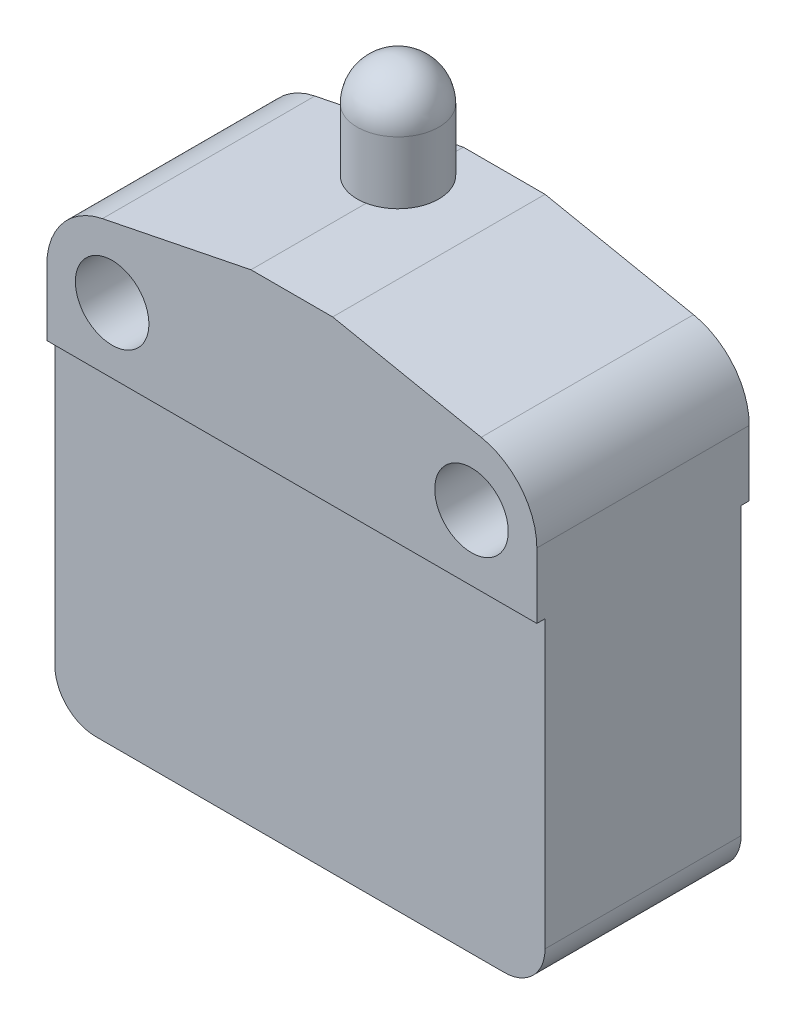
ISO-10303-21;
HEADER;
FILE_DESCRIPTION(('STEP AP214'),'2;1');
FILE_NAME('part.step','',(''),(''),'','','');
FILE_SCHEMA(('AUTOMOTIVE_DESIGN { 1 0 10303 214 1 1 1 1 }'));
ENDSEC;
DATA;
#1=APPLICATION_CONTEXT('core data for automotive mechanical design processes');
#2=APPLICATION_PROTOCOL_DEFINITION('international standard','automotive_design',2000,#1);
#3=PRODUCT_CONTEXT('',#1,'mechanical');
#4=PRODUCT('Part','Part','',(#3));
#5=PRODUCT_RELATED_PRODUCT_CATEGORY('part','',(#4));
#6=PRODUCT_DEFINITION_FORMATION('','',#4);
#7=PRODUCT_DEFINITION_CONTEXT('part definition',#1,'design');
#8=PRODUCT_DEFINITION('design','',#6,#7);
#9=PRODUCT_DEFINITION_SHAPE('','',#8);
#10=(LENGTH_UNIT() NAMED_UNIT(*) SI_UNIT(.MILLI.,.METRE.));
#11=(NAMED_UNIT(*) PLANE_ANGLE_UNIT() SI_UNIT($,.RADIAN.));
#12=(NAMED_UNIT(*) SI_UNIT($,.STERADIAN.) SOLID_ANGLE_UNIT());
#13=UNCERTAINTY_MEASURE_WITH_UNIT(LENGTH_MEASURE(1.E-05),#10,'distance_accuracy_value','');
#14=(GEOMETRIC_REPRESENTATION_CONTEXT(3) GLOBAL_UNCERTAINTY_ASSIGNED_CONTEXT((#13)) GLOBAL_UNIT_ASSIGNED_CONTEXT((#10,
#11,#12)) REPRESENTATION_CONTEXT('',''));
#15=CARTESIAN_POINT('',(0.,0.,0.));
#16=DIRECTION('',(0.,0.,1.));
#17=DIRECTION('',(1.,0.,0.));
#18=AXIS2_PLACEMENT_3D('',#15,#16,#17);
#19=CARTESIAN_POINT('',(12.5,-12.5,6.5));
#20=DIRECTION('',(0.,0.,1.));
#21=DIRECTION('',(1.,0.,0.));
#22=AXIS2_PLACEMENT_3D('',#19,#20,#21);
#23=PLANE('',#22);
#24=CARTESIAN_POINT('',(-11.,9.,6.5));
#25=DIRECTION('',(0.,0.,1.));
#26=DIRECTION('',(1.,0.,0.));
#27=AXIS2_PLACEMENT_3D('',#24,#25,#26);
#28=CIRCLE('',#27,2.25);
#29=CARTESIAN_POINT('',(-13.25,9.,6.5));
#30=VERTEX_POINT('',#29);
#31=EDGE_CURVE('E213',#30,#30,#28,.T.);
#32=ORIENTED_EDGE('',*,*,#31,.F.);
#33=EDGE_LOOP('',(#32));
#34=FACE_BOUND('',#33,.T.);
#35=CARTESIAN_POINT('',(11.,8.99999999999999,6.5));
#36=DIRECTION('',(0.,0.,1.));
#37=DIRECTION('',(-1.,0.,0.));
#38=AXIS2_PLACEMENT_3D('',#35,#36,#37);
#39=CIRCLE('',#38,2.25);
#40=CARTESIAN_POINT('',(8.75,8.99999999999999,6.5));
#41=VERTEX_POINT('',#40);
#42=EDGE_CURVE('E141',#41,#41,#39,.T.);
#43=ORIENTED_EDGE('',*,*,#42,.F.);
#44=EDGE_LOOP('',(#43));
#45=FACE_BOUND('',#44,.T.);
#46=DIRECTION('',(0.,-1.,0.));
#47=VECTOR('',#46,1.);
#48=CARTESIAN_POINT('',(-15.,9.,6.5));
#49=LINE('',#48,#47);
#50=CARTESIAN_POINT('',(-15.,9.,6.5));
#51=VERTEX_POINT('',#50);
#52=CARTESIAN_POINT('',(-15.,5.,6.5));
#53=VERTEX_POINT('',#52);
#54=EDGE_CURVE('E190',#51,#53,#49,.T.);
#55=ORIENTED_EDGE('',*,*,#54,.T.);
#56=DIRECTION('',(1.,0.,0.));
#57=VECTOR('',#56,1.);
#58=CARTESIAN_POINT('',(12.5,5.,6.5));
#59=LINE('',#58,#57);
#60=CARTESIAN_POINT('',(15.,5.,6.5));
#61=VERTEX_POINT('',#60);
#62=EDGE_CURVE('E128',#53,#61,#59,.T.);
#63=ORIENTED_EDGE('',*,*,#62,.T.);
#64=DIRECTION('',(0.,1.,0.));
#65=VECTOR('',#64,1.);
#66=CARTESIAN_POINT('',(15.,8.99999999999999,6.5));
#67=LINE('',#66,#65);
#68=CARTESIAN_POINT('',(15.,8.99999999999999,6.5));
#69=VERTEX_POINT('',#68);
#70=EDGE_CURVE('E208',#61,#69,#67,.T.);
#71=ORIENTED_EDGE('',*,*,#70,.T.);
#72=CARTESIAN_POINT('',(10.75,8.99999999999999,6.5));
#73=DIRECTION('',(0.,0.,1.));
#74=DIRECTION('',(-1.,0.,0.));
#75=AXIS2_PLACEMENT_3D('',#72,#73,#74);
#76=CIRCLE('',#75,4.25);
#77=CARTESIAN_POINT('',(11.5904722799773,13.1660660516355,6.5));
#78=VERTEX_POINT('',#77);
#79=EDGE_CURVE('E205',#69,#78,#76,.T.);
#80=ORIENTED_EDGE('',*,*,#79,.T.);
#81=DIRECTION('',(-0.980250835678939,0.197758183524076,0.));
#82=VECTOR('',#81,1.);
#83=CARTESIAN_POINT('',(2.5,15.,6.5));
#84=LINE('',#83,#82);
#85=CARTESIAN_POINT('',(2.5,15.,6.5));
#86=VERTEX_POINT('',#85);
#87=EDGE_CURVE('E202',#78,#86,#84,.T.);
#88=ORIENTED_EDGE('',*,*,#87,.T.);
#89=DIRECTION('',(-1.,0.,0.));
#90=VECTOR('',#89,1.);
#91=CARTESIAN_POINT('',(-2.5,15.,6.5));
#92=LINE('',#91,#90);
#93=CARTESIAN_POINT('',(-2.5,15.,6.5));
#94=VERTEX_POINT('',#93);
#95=EDGE_CURVE('E199',#86,#94,#92,.T.);
#96=ORIENTED_EDGE('',*,*,#95,.T.);
#97=DIRECTION('',(-0.980250835678939,-0.197758183524076,0.));
#98=VECTOR('',#97,1.);
#99=CARTESIAN_POINT('',(-2.5,15.,6.5));
#100=LINE('',#99,#98);
#101=CARTESIAN_POINT('',(-11.5904722799773,13.1660660516355,6.5));
#102=VERTEX_POINT('',#101);
#103=EDGE_CURVE('E196',#94,#102,#100,.T.);
#104=ORIENTED_EDGE('',*,*,#103,.T.);
#105=CARTESIAN_POINT('',(-10.75,9.,6.5));
#106=DIRECTION('',(0.,0.,1.));
#107=DIRECTION('',(1.,0.,0.));
#108=AXIS2_PLACEMENT_3D('',#105,#106,#107);
#109=CIRCLE('',#108,4.25);
#110=EDGE_CURVE('E192',#102,#51,#109,.T.);
#111=ORIENTED_EDGE('',*,*,#110,.T.);
#112=EDGE_LOOP('',(#55,#63,#71,#80,#88,#96,#104,#111));
#113=FACE_BOUND('',#112,.T.);
#114=ADVANCED_FACE('F41',(#34,#45,#113),#23,.T.);
#115=CARTESIAN_POINT('',(12.5,-12.5,-6.5));
#116=DIRECTION('',(0.,0.,1.));
#117=DIRECTION('',(1.,0.,0.));
#118=AXIS2_PLACEMENT_3D('',#115,#116,#117);
#119=PLANE('',#118);
#120=CARTESIAN_POINT('',(11.,8.99999999999999,-6.5));
#121=DIRECTION('',(0.,0.,1.));
#122=DIRECTION('',(-1.,0.,0.));
#123=AXIS2_PLACEMENT_3D('',#120,#121,#122);
#124=CIRCLE('',#123,2.25);
#125=CARTESIAN_POINT('',(8.75,8.99999999999999,-6.5));
#126=VERTEX_POINT('',#125);
#127=EDGE_CURVE('E195',#126,#126,#124,.T.);
#128=ORIENTED_EDGE('',*,*,#127,.T.);
#129=EDGE_LOOP('',(#128));
#130=FACE_BOUND('',#129,.T.);
#131=CARTESIAN_POINT('',(-11.,9.,-6.5));
#132=DIRECTION('',(0.,0.,1.));
#133=DIRECTION('',(1.,0.,0.));
#134=AXIS2_PLACEMENT_3D('',#131,#132,#133);
#135=CIRCLE('',#134,2.25);
#136=CARTESIAN_POINT('',(-13.25,9.,-6.5));
#137=VERTEX_POINT('',#136);
#138=EDGE_CURVE('E166',#137,#137,#135,.T.);
#139=ORIENTED_EDGE('',*,*,#138,.T.);
#140=EDGE_LOOP('',(#139));
#141=FACE_BOUND('',#140,.T.);
#142=DIRECTION('',(1.,0.,0.));
#143=VECTOR('',#142,1.);
#144=CARTESIAN_POINT('',(12.5,5.,-6.5));
#145=LINE('',#144,#143);
#146=CARTESIAN_POINT('',(-15.,5.,-6.5));
#147=VERTEX_POINT('',#146);
#148=CARTESIAN_POINT('',(15.,5.,-6.5));
#149=VERTEX_POINT('',#148);
#150=EDGE_CURVE('E108',#147,#149,#145,.T.);
#151=ORIENTED_EDGE('',*,*,#150,.F.);
#152=DIRECTION('',(0.,-1.,0.));
#153=VECTOR('',#152,1.);
#154=CARTESIAN_POINT('',(-15.,9.,-6.5));
#155=LINE('',#154,#153);
#156=CARTESIAN_POINT('',(-15.,9.,-6.5));
#157=VERTEX_POINT('',#156);
#158=EDGE_CURVE('E107',#157,#147,#155,.T.);
#159=ORIENTED_EDGE('',*,*,#158,.F.);
#160=CARTESIAN_POINT('',(-10.75,9.,-6.5));
#161=DIRECTION('',(0.,0.,1.));
#162=DIRECTION('',(1.,0.,0.));
#163=AXIS2_PLACEMENT_3D('',#160,#161,#162);
#164=CIRCLE('',#163,4.25);
#165=CARTESIAN_POINT('',(-11.5904722799773,13.1660660516355,-6.5));
#166=VERTEX_POINT('',#165);
#167=EDGE_CURVE('E168',#166,#157,#164,.T.);
#168=ORIENTED_EDGE('',*,*,#167,.F.);
#169=DIRECTION('',(-0.980250835678939,-0.197758183524076,0.));
#170=VECTOR('',#169,1.);
#171=CARTESIAN_POINT('',(-2.5,15.,-6.5));
#172=LINE('',#171,#170);
#173=CARTESIAN_POINT('',(-2.5,15.,-6.5));
#174=VERTEX_POINT('',#173);
#175=EDGE_CURVE('E173',#174,#166,#172,.T.);
#176=ORIENTED_EDGE('',*,*,#175,.F.);
#177=DIRECTION('',(-1.,0.,0.));
#178=VECTOR('',#177,1.);
#179=CARTESIAN_POINT('',(-2.5,15.,-6.5));
#180=LINE('',#179,#178);
#181=CARTESIAN_POINT('',(2.5,15.,-6.5));
#182=VERTEX_POINT('',#181);
#183=EDGE_CURVE('E176',#182,#174,#180,.T.);
#184=ORIENTED_EDGE('',*,*,#183,.F.);
#185=DIRECTION('',(-0.980250835678939,0.197758183524076,0.));
#186=VECTOR('',#185,1.);
#187=CARTESIAN_POINT('',(2.5,15.,-6.5));
#188=LINE('',#187,#186);
#189=CARTESIAN_POINT('',(11.5904722799773,13.1660660516355,-6.5));
#190=VERTEX_POINT('',#189);
#191=EDGE_CURVE('E180',#190,#182,#188,.T.);
#192=ORIENTED_EDGE('',*,*,#191,.F.);
#193=CARTESIAN_POINT('',(10.75,8.99999999999999,-6.5));
#194=DIRECTION('',(0.,0.,1.));
#195=DIRECTION('',(-1.,0.,0.));
#196=AXIS2_PLACEMENT_3D('',#193,#194,#195);
#197=CIRCLE('',#196,4.25);
#198=CARTESIAN_POINT('',(15.,8.99999999999999,-6.5));
#199=VERTEX_POINT('',#198);
#200=EDGE_CURVE('E184',#199,#190,#197,.T.);
#201=ORIENTED_EDGE('',*,*,#200,.F.);
#202=DIRECTION('',(0.,1.,0.));
#203=VECTOR('',#202,1.);
#204=CARTESIAN_POINT('',(15.,8.99999999999999,-6.5));
#205=LINE('',#204,#203);
#206=EDGE_CURVE('E187',#149,#199,#205,.T.);
#207=ORIENTED_EDGE('',*,*,#206,.F.);
#208=EDGE_LOOP('',(#151,#159,#168,#176,#184,#192,#201,#207));
#209=FACE_BOUND('',#208,.T.);
#210=ADVANCED_FACE('F225',(#130,#141,#209),#119,.F.);
#211=CARTESIAN_POINT('',(12.5,-12.5,6.5));
#212=DIRECTION('',(0.,0.,-1.));
#213=DIRECTION('',(-1.,0.,0.));
#214=AXIS2_PLACEMENT_3D('',#211,#212,#213);
#215=CYLINDRICAL_SURFACE('',#214,2.5);
#216=CARTESIAN_POINT('',(12.5,-12.5,6.));
#217=DIRECTION('',(0.,0.,1.));
#218=DIRECTION('',(1.,0.,0.));
#219=AXIS2_PLACEMENT_3D('',#216,#217,#218);
#220=CIRCLE('',#219,2.5);
#221=CARTESIAN_POINT('',(12.5,-15.,6.));
#222=VERTEX_POINT('',#221);
#223=CARTESIAN_POINT('',(15.,-12.5,6.));
#224=VERTEX_POINT('',#223);
#225=EDGE_CURVE('E115',#222,#224,#220,.T.);
#226=ORIENTED_EDGE('',*,*,#225,.F.);
#227=DIRECTION('',(0.,0.,-1.));
#228=VECTOR('',#227,1.);
#229=CARTESIAN_POINT('',(12.5,-15.,6.5));
#230=LINE('',#229,#228);
#231=CARTESIAN_POINT('',(12.5,-15.,-6.));
#232=VERTEX_POINT('',#231);
#233=EDGE_CURVE('E163',#222,#232,#230,.T.);
#234=ORIENTED_EDGE('',*,*,#233,.T.);
#235=CARTESIAN_POINT('',(12.5,-12.5,-6.));
#236=DIRECTION('',(0.,0.,-1.));
#237=DIRECTION('',(-1.,0.,0.));
#238=AXIS2_PLACEMENT_3D('',#235,#236,#237);
#239=CIRCLE('',#238,2.5);
#240=CARTESIAN_POINT('',(15.,-12.5,-6.));
#241=VERTEX_POINT('',#240);
#242=EDGE_CURVE('E138',#241,#232,#239,.T.);
#243=ORIENTED_EDGE('',*,*,#242,.F.);
#244=DIRECTION('',(0.,0.,-1.));
#245=VECTOR('',#244,1.);
#246=CARTESIAN_POINT('',(15.,-12.5,6.5));
#247=LINE('',#246,#245);
#248=EDGE_CURVE('E165',#224,#241,#247,.T.);
#249=ORIENTED_EDGE('',*,*,#248,.F.);
#250=EDGE_LOOP('',(#226,#234,#243,#249));
#251=FACE_BOUND('',#250,.T.);
#252=ADVANCED_FACE('F261',(#251),#215,.T.);
#253=CARTESIAN_POINT('',(15.,8.99999999999999,6.5));
#254=DIRECTION('',(-1.,0.,0.));
#255=DIRECTION('',(0.,-1.,0.));
#256=AXIS2_PLACEMENT_3D('',#253,#254,#255);
#257=PLANE('',#256);
#258=DIRECTION('',(0.,0.,1.));
#259=VECTOR('',#258,1.);
#260=CARTESIAN_POINT('',(15.,5.,6.5));
#261=LINE('',#260,#259);
#262=CARTESIAN_POINT('',(15.,5.,6.));
#263=VERTEX_POINT('',#262);
#264=EDGE_CURVE('E111',#263,#61,#261,.T.);
#265=ORIENTED_EDGE('',*,*,#264,.F.);
#266=DIRECTION('',(0.,1.,0.));
#267=VECTOR('',#266,1.);
#268=CARTESIAN_POINT('',(15.,8.99999999999999,6.));
#269=LINE('',#268,#267);
#270=EDGE_CURVE('E121',#224,#263,#269,.T.);
#271=ORIENTED_EDGE('',*,*,#270,.F.);
#272=ORIENTED_EDGE('',*,*,#248,.T.);
#273=DIRECTION('',(0.,-1.,0.));
#274=VECTOR('',#273,1.);
#275=CARTESIAN_POINT('',(15.,8.99999999999999,-6.));
#276=LINE('',#275,#274);
#277=CARTESIAN_POINT('',(15.,5.,-6.));
#278=VERTEX_POINT('',#277);
#279=EDGE_CURVE('E101',#278,#241,#276,.T.);
#280=ORIENTED_EDGE('',*,*,#279,.F.);
#281=EDGE_CURVE('E100',#149,#278,#261,.T.);
#282=ORIENTED_EDGE('',*,*,#281,.F.);
#283=ORIENTED_EDGE('',*,*,#206,.T.);
#284=DIRECTION('',(0.,0.,-1.));
#285=VECTOR('',#284,1.);
#286=CARTESIAN_POINT('',(15.,8.99999999999999,6.5));
#287=LINE('',#286,#285);
#288=EDGE_CURVE('E183',#69,#199,#287,.T.);
#289=ORIENTED_EDGE('',*,*,#288,.F.);
#290=ORIENTED_EDGE('',*,*,#70,.F.);
#291=EDGE_LOOP('',(#265,#271,#272,#280,#282,#283,#289,#290));
#292=FACE_BOUND('',#291,.T.);
#293=ADVANCED_FACE('F259',(#292),#257,.F.);
#294=CARTESIAN_POINT('',(-15.,9.,6.5));
#295=DIRECTION('',(1.,0.,0.));
#296=DIRECTION('',(0.,1.,0.));
#297=AXIS2_PLACEMENT_3D('',#294,#295,#296);
#298=PLANE('',#297);
#299=DIRECTION('',(0.,0.,-1.));
#300=VECTOR('',#299,1.);
#301=CARTESIAN_POINT('',(-15.,5.,6.5));
#302=LINE('',#301,#300);
#303=CARTESIAN_POINT('',(-15.,5.,6.));
#304=VERTEX_POINT('',#303);
#305=EDGE_CURVE('E110',#53,#304,#302,.T.);
#306=ORIENTED_EDGE('',*,*,#305,.F.);
#307=ORIENTED_EDGE('',*,*,#54,.F.);
#308=DIRECTION('',(0.,0.,-1.));
#309=VECTOR('',#308,1.);
#310=CARTESIAN_POINT('',(-15.,9.,6.5));
#311=LINE('',#310,#309);
#312=EDGE_CURVE('E158',#51,#157,#311,.T.);
#313=ORIENTED_EDGE('',*,*,#312,.T.);
#314=ORIENTED_EDGE('',*,*,#158,.T.);
#315=CARTESIAN_POINT('',(-15.,5.,-6.));
#316=VERTEX_POINT('',#315);
#317=EDGE_CURVE('E97',#316,#147,#302,.T.);
#318=ORIENTED_EDGE('',*,*,#317,.F.);
#319=DIRECTION('',(0.,1.,0.));
#320=VECTOR('',#319,1.);
#321=CARTESIAN_POINT('',(-15.,9.,-6.));
#322=LINE('',#321,#320);
#323=CARTESIAN_POINT('',(-15.,-12.5,-6.));
#324=VERTEX_POINT('',#323);
#325=EDGE_CURVE('E80',#324,#316,#322,.T.);
#326=ORIENTED_EDGE('',*,*,#325,.F.);
#327=DIRECTION('',(0.,0.,-1.));
#328=VECTOR('',#327,1.);
#329=CARTESIAN_POINT('',(-15.,-12.5,6.5));
#330=LINE('',#329,#328);
#331=CARTESIAN_POINT('',(-15.,-12.5,6.));
#332=VERTEX_POINT('',#331);
#333=EDGE_CURVE('E150',#332,#324,#330,.T.);
#334=ORIENTED_EDGE('',*,*,#333,.F.);
#335=DIRECTION('',(0.,-1.,0.));
#336=VECTOR('',#335,1.);
#337=CARTESIAN_POINT('',(-15.,9.,6.));
#338=LINE('',#337,#336);
#339=EDGE_CURVE('E134',#304,#332,#338,.T.);
#340=ORIENTED_EDGE('',*,*,#339,.F.);
#341=EDGE_LOOP('',(#306,#307,#313,#314,#318,#326,#334,#340));
#342=FACE_BOUND('',#341,.T.);
#343=ADVANCED_FACE('F104',(#342),#298,.F.);
#344=CARTESIAN_POINT('',(-12.5,-12.5,6.5));
#345=DIRECTION('',(0.,0.,-1.));
#346=DIRECTION('',(-1.,0.,0.));
#347=AXIS2_PLACEMENT_3D('',#344,#345,#346);
#348=CYLINDRICAL_SURFACE('',#347,2.5);
#349=CARTESIAN_POINT('',(-12.5,-12.5,6.));
#350=DIRECTION('',(0.,0.,1.));
#351=DIRECTION('',(1.,0.,0.));
#352=AXIS2_PLACEMENT_3D('',#349,#350,#351);
#353=CIRCLE('',#352,2.5);
#354=CARTESIAN_POINT('',(-12.5,-15.,6.));
#355=VERTEX_POINT('',#354);
#356=EDGE_CURVE('E51',#332,#355,#353,.T.);
#357=ORIENTED_EDGE('',*,*,#356,.F.);
#358=ORIENTED_EDGE('',*,*,#333,.T.);
#359=CARTESIAN_POINT('',(-12.5,-12.5,-6.));
#360=DIRECTION('',(0.,0.,-1.));
#361=DIRECTION('',(-1.,0.,0.));
#362=AXIS2_PLACEMENT_3D('',#359,#360,#361);
#363=CIRCLE('',#362,2.5);
#364=CARTESIAN_POINT('',(-12.5,-15.,-6.));
#365=VERTEX_POINT('',#364);
#366=EDGE_CURVE('E87',#365,#324,#363,.T.);
#367=ORIENTED_EDGE('',*,*,#366,.F.);
#368=DIRECTION('',(0.,0.,-1.));
#369=VECTOR('',#368,1.);
#370=CARTESIAN_POINT('',(-12.5,-15.,6.5));
#371=LINE('',#370,#369);
#372=EDGE_CURVE('E153',#355,#365,#371,.T.);
#373=ORIENTED_EDGE('',*,*,#372,.F.);
#374=EDGE_LOOP('',(#357,#358,#367,#373));
#375=FACE_BOUND('',#374,.T.);
#376=ADVANCED_FACE('F311',(#375),#348,.T.);
#377=CARTESIAN_POINT('',(-12.5,-15.,6.5));
#378=DIRECTION('',(0.,1.,0.));
#379=DIRECTION('',(0.,0.,1.));
#380=AXIS2_PLACEMENT_3D('',#377,#378,#379);
#381=PLANE('',#380);
#382=DIRECTION('',(1.,0.,0.));
#383=VECTOR('',#382,1.);
#384=CARTESIAN_POINT('',(-12.5,-15.,6.));
#385=LINE('',#384,#383);
#386=EDGE_CURVE('E13',#355,#222,#385,.T.);
#387=ORIENTED_EDGE('',*,*,#386,.F.);
#388=ORIENTED_EDGE('',*,*,#372,.T.);
#389=DIRECTION('',(-1.,0.,0.));
#390=VECTOR('',#389,1.);
#391=CARTESIAN_POINT('',(-12.5,-15.,-6.));
#392=LINE('',#391,#390);
#393=EDGE_CURVE('E140',#232,#365,#392,.T.);
#394=ORIENTED_EDGE('',*,*,#393,.F.);
#395=ORIENTED_EDGE('',*,*,#233,.F.);
#396=EDGE_LOOP('',(#387,#388,#394,#395));
#397=FACE_BOUND('',#396,.T.);
#398=ADVANCED_FACE('F309',(#397),#381,.F.);
#399=CARTESIAN_POINT('',(-2.5,15.,6.5));
#400=DIRECTION('',(0.,-1.,0.));
#401=DIRECTION('',(1.,0.,0.));
#402=AXIS2_PLACEMENT_3D('',#399,#400,#401);
#403=PLANE('',#402);
#404=DIRECTION('',(0.,0.,-1.));
#405=VECTOR('',#404,1.);
#406=CARTESIAN_POINT('',(2.5,15.,6.5));
#407=LINE('',#406,#405);
#408=EDGE_CURVE('E156',#86,#182,#407,.T.);
#409=ORIENTED_EDGE('',*,*,#408,.T.);
#410=ORIENTED_EDGE('',*,*,#183,.T.);
#411=DIRECTION('',(0.,0.,-1.));
#412=VECTOR('',#411,1.);
#413=CARTESIAN_POINT('',(-2.5,15.,6.5));
#414=LINE('',#413,#412);
#415=EDGE_CURVE('E172',#94,#174,#414,.T.);
#416=ORIENTED_EDGE('',*,*,#415,.F.);
#417=ORIENTED_EDGE('',*,*,#95,.F.);
#418=EDGE_LOOP('',(#409,#410,#416,#417));
#419=FACE_BOUND('',#418,.T.);
#420=ADVANCED_FACE('F305',(#419),#403,.F.);
#421=CARTESIAN_POINT('',(10.75,8.99999999999999,6.5));
#422=DIRECTION('',(0.,0.,-1.));
#423=DIRECTION('',(-1.,0.,0.));
#424=AXIS2_PLACEMENT_3D('',#421,#422,#423);
#425=CYLINDRICAL_SURFACE('',#424,4.25);
#426=ORIENTED_EDGE('',*,*,#200,.T.);
#427=DIRECTION('',(0.,0.,-1.));
#428=VECTOR('',#427,1.);
#429=CARTESIAN_POINT('',(11.5904722799773,13.1660660516355,6.5));
#430=LINE('',#429,#428);
#431=EDGE_CURVE('E179',#78,#190,#430,.T.);
#432=ORIENTED_EDGE('',*,*,#431,.F.);
#433=ORIENTED_EDGE('',*,*,#79,.F.);
#434=ORIENTED_EDGE('',*,*,#288,.T.);
#435=EDGE_LOOP('',(#426,#432,#433,#434));
#436=FACE_BOUND('',#435,.T.);
#437=ADVANCED_FACE('F295',(#436),#425,.T.);
#438=CARTESIAN_POINT('',(2.5,15.,6.5));
#439=DIRECTION('',(-0.197758183524076,-0.980250835678939,0.));
#440=DIRECTION('',(0.980250835678939,-0.197758183524076,0.));
#441=AXIS2_PLACEMENT_3D('',#438,#439,#440);
#442=PLANE('',#441);
#443=ORIENTED_EDGE('',*,*,#191,.T.);
#444=ORIENTED_EDGE('',*,*,#408,.F.);
#445=ORIENTED_EDGE('',*,*,#87,.F.);
#446=ORIENTED_EDGE('',*,*,#431,.T.);
#447=EDGE_LOOP('',(#443,#444,#445,#446));
#448=FACE_BOUND('',#447,.T.);
#449=ADVANCED_FACE('F301',(#448),#442,.F.);
#450=CARTESIAN_POINT('',(-2.5,15.,6.5));
#451=DIRECTION('',(0.197758183524076,-0.980250835678939,0.));
#452=DIRECTION('',(0.980250835678939,0.197758183524076,0.));
#453=AXIS2_PLACEMENT_3D('',#450,#451,#452);
#454=PLANE('',#453);
#455=ORIENTED_EDGE('',*,*,#175,.T.);
#456=DIRECTION('',(0.,0.,-1.));
#457=VECTOR('',#456,1.);
#458=CARTESIAN_POINT('',(-11.5904722799773,13.1660660516355,6.5));
#459=LINE('',#458,#457);
#460=EDGE_CURVE('E171',#102,#166,#459,.T.);
#461=ORIENTED_EDGE('',*,*,#460,.F.);
#462=ORIENTED_EDGE('',*,*,#103,.F.);
#463=ORIENTED_EDGE('',*,*,#415,.T.);
#464=EDGE_LOOP('',(#455,#461,#462,#463));
#465=FACE_BOUND('',#464,.T.);
#466=ADVANCED_FACE('F373',(#465),#454,.F.);
#467=CARTESIAN_POINT('',(-10.75,9.,6.5));
#468=DIRECTION('',(0.,0.,-1.));
#469=DIRECTION('',(-1.,0.,0.));
#470=AXIS2_PLACEMENT_3D('',#467,#468,#469);
#471=CYLINDRICAL_SURFACE('',#470,4.25);
#472=ORIENTED_EDGE('',*,*,#167,.T.);
#473=ORIENTED_EDGE('',*,*,#312,.F.);
#474=ORIENTED_EDGE('',*,*,#110,.F.);
#475=ORIENTED_EDGE('',*,*,#460,.T.);
#476=EDGE_LOOP('',(#472,#473,#474,#475));
#477=FACE_BOUND('',#476,.T.);
#478=ADVANCED_FACE('F277',(#477),#471,.T.);
#479=CARTESIAN_POINT('',(-11.,9.,6.5));
#480=DIRECTION('',(0.,0.,-1.));
#481=DIRECTION('',(-1.,0.,0.));
#482=AXIS2_PLACEMENT_3D('',#479,#480,#481);
#483=CYLINDRICAL_SURFACE('',#482,2.25);
#484=CARTESIAN_POINT('',(-13.25,9.,6.5));
#485=CARTESIAN_POINT('',(-13.25,9.,6.36458333333333));
#486=CARTESIAN_POINT('',(-13.25,9.,6.22916666666667));
#487=CARTESIAN_POINT('',(-13.25,9.,5.95833333333333));
#488=CARTESIAN_POINT('',(-13.25,9.,5.82291666666667));
#489=CARTESIAN_POINT('',(-13.25,9.,5.55208333333333));
#490=CARTESIAN_POINT('',(-13.25,9.,5.41666666666667));
#491=CARTESIAN_POINT('',(-13.25,9.,5.14583333333333));
#492=CARTESIAN_POINT('',(-13.25,9.,5.01041666666667));
#493=CARTESIAN_POINT('',(-13.25,9.,4.73958333333333));
#494=CARTESIAN_POINT('',(-13.25,9.,4.60416666666667));
#495=CARTESIAN_POINT('',(-13.25,9.,4.33333333333333));
#496=CARTESIAN_POINT('',(-13.25,9.,4.19791666666667));
#497=CARTESIAN_POINT('',(-13.25,9.,3.92708333333333));
#498=CARTESIAN_POINT('',(-13.25,9.,3.79166666666667));
#499=CARTESIAN_POINT('',(-13.25,9.,3.52083333333333));
#500=CARTESIAN_POINT('',(-13.25,9.,3.38541666666667));
#501=CARTESIAN_POINT('',(-13.25,9.,3.11458333333333));
#502=CARTESIAN_POINT('',(-13.25,9.,2.97916666666667));
#503=CARTESIAN_POINT('',(-13.25,9.,2.70833333333333));
#504=CARTESIAN_POINT('',(-13.25,9.,2.57291666666667));
#505=CARTESIAN_POINT('',(-13.25,9.,2.30208333333333));
#506=CARTESIAN_POINT('',(-13.25,9.,2.16666666666667));
#507=CARTESIAN_POINT('',(-13.25,9.,1.89583333333333));
#508=CARTESIAN_POINT('',(-13.25,9.,1.76041666666667));
#509=CARTESIAN_POINT('',(-13.25,9.,1.48958333333333));
#510=CARTESIAN_POINT('',(-13.25,9.,1.35416666666667));
#511=CARTESIAN_POINT('',(-13.25,9.,1.08333333333333));
#512=CARTESIAN_POINT('',(-13.25,9.,0.947916666666666));
#513=CARTESIAN_POINT('',(-13.25,9.,0.677083333333332));
#514=CARTESIAN_POINT('',(-13.25,9.,0.541666666666666));
#515=CARTESIAN_POINT('',(-13.25,9.,0.270833333333333));
#516=CARTESIAN_POINT('',(-13.25,9.,0.135416666666666));
#517=CARTESIAN_POINT('',(-13.25,9.,-0.135416666666668));
#518=CARTESIAN_POINT('',(-13.25,9.,-0.270833333333334));
#519=CARTESIAN_POINT('',(-13.25,9.,-0.541666666666668));
#520=CARTESIAN_POINT('',(-13.25,9.,-0.677083333333334));
#521=CARTESIAN_POINT('',(-13.25,9.,-0.947916666666667));
#522=CARTESIAN_POINT('',(-13.25,9.,-1.08333333333333));
#523=CARTESIAN_POINT('',(-13.25,9.,-1.35416666666667));
#524=CARTESIAN_POINT('',(-13.25,9.,-1.48958333333333));
#525=CARTESIAN_POINT('',(-13.25,9.,-1.76041666666667));
#526=CARTESIAN_POINT('',(-13.25,9.,-1.89583333333333));
#527=CARTESIAN_POINT('',(-13.25,9.,-2.16666666666667));
#528=CARTESIAN_POINT('',(-13.25,9.,-2.30208333333333));
#529=CARTESIAN_POINT('',(-13.25,9.,-2.57291666666667));
#530=CARTESIAN_POINT('',(-13.25,9.,-2.70833333333333));
#531=CARTESIAN_POINT('',(-13.25,9.,-2.97916666666667));
#532=CARTESIAN_POINT('',(-13.25,9.,-3.11458333333333));
#533=CARTESIAN_POINT('',(-13.25,9.,-3.38541666666667));
#534=CARTESIAN_POINT('',(-13.25,9.,-3.52083333333333));
#535=CARTESIAN_POINT('',(-13.25,9.,-3.79166666666667));
#536=CARTESIAN_POINT('',(-13.25,9.,-3.92708333333333));
#537=CARTESIAN_POINT('',(-13.25,9.,-4.19791666666667));
#538=CARTESIAN_POINT('',(-13.25,9.,-4.33333333333333));
#539=CARTESIAN_POINT('',(-13.25,9.,-4.60416666666667));
#540=CARTESIAN_POINT('',(-13.25,9.,-4.73958333333333));
#541=CARTESIAN_POINT('',(-13.25,9.,-5.01041666666667));
#542=CARTESIAN_POINT('',(-13.25,9.,-5.14583333333333));
#543=CARTESIAN_POINT('',(-13.25,9.,-5.41666666666667));
#544=CARTESIAN_POINT('',(-13.25,9.,-5.55208333333333));
#545=CARTESIAN_POINT('',(-13.25,9.,-5.82291666666667));
#546=CARTESIAN_POINT('',(-13.25,9.,-5.95833333333333));
#547=CARTESIAN_POINT('',(-13.25,9.,-6.22916666666667));
#548=CARTESIAN_POINT('',(-13.25,9.,-6.36458333333333));
#549=CARTESIAN_POINT('',(-13.25,9.,-6.5));
#550=B_SPLINE_CURVE_WITH_KNOTS('',3,(#484,#485,#486,#487,#488,#489,#490,#491,#492,#493,#494,
#495,#496,#497,#498,#499,#500,#501,#502,#503,#504,#505,#506,#507,#508,#509,#510,#511,#512,#513,
#514,#515,#516,#517,#518,#519,#520,#521,#522,#523,#524,#525,#526,#527,#528,#529,#530,#531,#532,
#533,#534,#535,#536,#537,#538,#539,#540,#541,#542,#543,#544,#545,#546,#547,#548,#549),
.UNSPECIFIED.,.F.,.F.,(4,2,2,2,2,2,2,2,2,2,2,2,2,2,2,2,2,2,2,2,2,2,2,2,2,2,2,2,2,2,2,2,4),(0.,
0.40625,0.8125,1.21875,1.625,2.03125,2.4375,2.84375,3.25,3.65625,4.0625,4.46875,4.875,5.28125,
5.6875,6.09375,6.5,6.90625,7.3125,7.71875,8.125,8.53125,8.9375,9.34375,9.75,10.15625,10.5625,
10.96875,11.375,11.78125,12.1875,12.59375,13.),.UNSPECIFIED.);
#551=EDGE_CURVE('BSEAM325',#30,#137,#550,.T.);
#552=ORIENTED_EDGE('',*,*,#31,.T.);
#553=ORIENTED_EDGE('',*,*,#138,.F.);
#554=ORIENTED_EDGE('',*,*,#551,.T.);
#555=ORIENTED_EDGE('',*,*,#551,.F.);
#556=EDGE_LOOP('',(#552,#554,#553,#555));
#557=FACE_BOUND('',#556,.T.);
#558=ADVANCED_FACE('F325',(#557),#483,.F.);
#559=CARTESIAN_POINT('',(11.,8.99999999999999,6.5));
#560=DIRECTION('',(0.,0.,-1.));
#561=DIRECTION('',(-1.,0.,0.));
#562=AXIS2_PLACEMENT_3D('',#559,#560,#561);
#563=CYLINDRICAL_SURFACE('',#562,2.25);
#564=CARTESIAN_POINT('',(8.75,8.99999999999999,6.5));
#565=CARTESIAN_POINT('',(8.75,8.99999999999999,6.36458333333333));
#566=CARTESIAN_POINT('',(8.75,8.99999999999999,6.22916666666667));
#567=CARTESIAN_POINT('',(8.75,8.99999999999999,5.95833333333333));
#568=CARTESIAN_POINT('',(8.75,8.99999999999999,5.82291666666667));
#569=CARTESIAN_POINT('',(8.75,8.99999999999999,5.55208333333333));
#570=CARTESIAN_POINT('',(8.75,8.99999999999999,5.41666666666667));
#571=CARTESIAN_POINT('',(8.75,8.99999999999999,5.14583333333333));
#572=CARTESIAN_POINT('',(8.75,8.99999999999999,5.01041666666667));
#573=CARTESIAN_POINT('',(8.75,8.99999999999999,4.73958333333333));
#574=CARTESIAN_POINT('',(8.75,8.99999999999999,4.60416666666667));
#575=CARTESIAN_POINT('',(8.75,8.99999999999999,4.33333333333333));
#576=CARTESIAN_POINT('',(8.75,8.99999999999999,4.19791666666667));
#577=CARTESIAN_POINT('',(8.75,8.99999999999999,3.92708333333333));
#578=CARTESIAN_POINT('',(8.75,8.99999999999999,3.79166666666667));
#579=CARTESIAN_POINT('',(8.75,8.99999999999999,3.52083333333333));
#580=CARTESIAN_POINT('',(8.75,8.99999999999999,3.38541666666667));
#581=CARTESIAN_POINT('',(8.75,8.99999999999999,3.11458333333333));
#582=CARTESIAN_POINT('',(8.75,8.99999999999999,2.97916666666667));
#583=CARTESIAN_POINT('',(8.75,8.99999999999999,2.70833333333333));
#584=CARTESIAN_POINT('',(8.75,8.99999999999999,2.57291666666667));
#585=CARTESIAN_POINT('',(8.75,8.99999999999999,2.30208333333333));
#586=CARTESIAN_POINT('',(8.75,8.99999999999999,2.16666666666667));
#587=CARTESIAN_POINT('',(8.75,8.99999999999999,1.89583333333333));
#588=CARTESIAN_POINT('',(8.75,8.99999999999999,1.76041666666667));
#589=CARTESIAN_POINT('',(8.75,8.99999999999999,1.48958333333333));
#590=CARTESIAN_POINT('',(8.75,8.99999999999999,1.35416666666667));
#591=CARTESIAN_POINT('',(8.75,8.99999999999999,1.08333333333333));
#592=CARTESIAN_POINT('',(8.75,8.99999999999999,0.947916666666666));
#593=CARTESIAN_POINT('',(8.75,8.99999999999999,0.677083333333332));
#594=CARTESIAN_POINT('',(8.75,8.99999999999999,0.541666666666666));
#595=CARTESIAN_POINT('',(8.75,8.99999999999999,0.270833333333333));
#596=CARTESIAN_POINT('',(8.75,8.99999999999999,0.135416666666666));
#597=CARTESIAN_POINT('',(8.75,8.99999999999999,-0.135416666666668));
#598=CARTESIAN_POINT('',(8.75,8.99999999999999,-0.270833333333334));
#599=CARTESIAN_POINT('',(8.75,8.99999999999999,-0.541666666666668));
#600=CARTESIAN_POINT('',(8.75,8.99999999999999,-0.677083333333334));
#601=CARTESIAN_POINT('',(8.75,8.99999999999999,-0.947916666666667));
#602=CARTESIAN_POINT('',(8.75,8.99999999999999,-1.08333333333333));
#603=CARTESIAN_POINT('',(8.75,8.99999999999999,-1.35416666666667));
#604=CARTESIAN_POINT('',(8.75,8.99999999999999,-1.48958333333333));
#605=CARTESIAN_POINT('',(8.75,8.99999999999999,-1.76041666666667));
#606=CARTESIAN_POINT('',(8.75,8.99999999999999,-1.89583333333333));
#607=CARTESIAN_POINT('',(8.75,8.99999999999999,-2.16666666666667));
#608=CARTESIAN_POINT('',(8.75,8.99999999999999,-2.30208333333333));
#609=CARTESIAN_POINT('',(8.75,8.99999999999999,-2.57291666666667));
#610=CARTESIAN_POINT('',(8.75,8.99999999999999,-2.70833333333333));
#611=CARTESIAN_POINT('',(8.75,8.99999999999999,-2.97916666666667));
#612=CARTESIAN_POINT('',(8.75,8.99999999999999,-3.11458333333333));
#613=CARTESIAN_POINT('',(8.75,8.99999999999999,-3.38541666666667));
#614=CARTESIAN_POINT('',(8.75,8.99999999999999,-3.52083333333333));
#615=CARTESIAN_POINT('',(8.75,8.99999999999999,-3.79166666666667));
#616=CARTESIAN_POINT('',(8.75,8.99999999999999,-3.92708333333333));
#617=CARTESIAN_POINT('',(8.75,8.99999999999999,-4.19791666666667));
#618=CARTESIAN_POINT('',(8.75,8.99999999999999,-4.33333333333333));
#619=CARTESIAN_POINT('',(8.75,8.99999999999999,-4.60416666666667));
#620=CARTESIAN_POINT('',(8.75,8.99999999999999,-4.73958333333333));
#621=CARTESIAN_POINT('',(8.75,8.99999999999999,-5.01041666666667));
#622=CARTESIAN_POINT('',(8.75,8.99999999999999,-5.14583333333333));
#623=CARTESIAN_POINT('',(8.75,8.99999999999999,-5.41666666666667));
#624=CARTESIAN_POINT('',(8.75,8.99999999999999,-5.55208333333333));
#625=CARTESIAN_POINT('',(8.75,8.99999999999999,-5.82291666666667));
#626=CARTESIAN_POINT('',(8.75,8.99999999999999,-5.95833333333333));
#627=CARTESIAN_POINT('',(8.75,8.99999999999999,-6.22916666666667));
#628=CARTESIAN_POINT('',(8.75,8.99999999999999,-6.36458333333333));
#629=CARTESIAN_POINT('',(8.75,8.99999999999999,-6.5));
#630=B_SPLINE_CURVE_WITH_KNOTS('',3,(#564,#565,#566,#567,#568,#569,#570,#571,#572,#573,#574,
#575,#576,#577,#578,#579,#580,#581,#582,#583,#584,#585,#586,#587,#588,#589,#590,#591,#592,#593,
#594,#595,#596,#597,#598,#599,#600,#601,#602,#603,#604,#605,#606,#607,#608,#609,#610,#611,#612,
#613,#614,#615,#616,#617,#618,#619,#620,#621,#622,#623,#624,#625,#626,#627,#628,#629),
.UNSPECIFIED.,.F.,.F.,(4,2,2,2,2,2,2,2,2,2,2,2,2,2,2,2,2,2,2,2,2,2,2,2,2,2,2,2,2,2,2,2,4),(0.,
0.40625,0.8125,1.21875,1.625,2.03125,2.4375,2.84375,3.25,3.65625,4.0625,4.46875,4.875,5.28125,
5.6875,6.09375,6.5,6.90625,7.3125,7.71875,8.125,8.53125,8.9375,9.34375,9.75,10.15625,10.5625,
10.96875,11.375,11.78125,12.1875,12.59375,13.),.UNSPECIFIED.);
#631=EDGE_CURVE('BSEAM220',#41,#126,#630,.T.);
#632=ORIENTED_EDGE('',*,*,#42,.T.);
#633=ORIENTED_EDGE('',*,*,#127,.F.);
#634=ORIENTED_EDGE('',*,*,#631,.T.);
#635=ORIENTED_EDGE('',*,*,#631,.F.);
#636=EDGE_LOOP('',(#632,#634,#633,#635));
#637=FACE_BOUND('',#636,.T.);
#638=ADVANCED_FACE('F220',(#637),#563,.F.);
#639=CARTESIAN_POINT('',(21.3158627223038,5.,-6.));
#640=DIRECTION('',(0.,0.,-1.));
#641=DIRECTION('',(-1.,0.,0.));
#642=AXIS2_PLACEMENT_3D('',#639,#640,#641);
#643=PLANE('',#642);
#644=ORIENTED_EDGE('',*,*,#242,.T.);
#645=ORIENTED_EDGE('',*,*,#393,.T.);
#646=ORIENTED_EDGE('',*,*,#366,.T.);
#647=ORIENTED_EDGE('',*,*,#325,.T.);
#648=DIRECTION('',(1.,0.,0.));
#649=VECTOR('',#648,1.);
#650=CARTESIAN_POINT('',(21.3158627223038,5.,-6.));
#651=LINE('',#650,#649);
#652=EDGE_CURVE('E45',#316,#278,#651,.T.);
#653=ORIENTED_EDGE('',*,*,#652,.T.);
#654=ORIENTED_EDGE('',*,*,#279,.T.);
#655=EDGE_LOOP('',(#644,#645,#646,#647,#653,#654));
#656=FACE_BOUND('',#655,.T.);
#657=ADVANCED_FACE('F83',(#656),#643,.T.);
#658=CARTESIAN_POINT('',(0.,5.,0.));
#659=DIRECTION('',(0.,-1.,0.));
#660=DIRECTION('',(0.,0.,-1.));
#661=AXIS2_PLACEMENT_3D('',#658,#659,#660);
#662=PLANE('',#661);
#663=ORIENTED_EDGE('',*,*,#281,.T.);
#664=ORIENTED_EDGE('',*,*,#652,.F.);
#665=ORIENTED_EDGE('',*,*,#317,.T.);
#666=ORIENTED_EDGE('',*,*,#150,.T.);
#667=EDGE_LOOP('',(#663,#664,#665,#666));
#668=FACE_BOUND('',#667,.T.);
#669=ADVANCED_FACE('F95',(#668),#662,.T.);
#670=ORIENTED_EDGE('',*,*,#264,.T.);
#671=ORIENTED_EDGE('',*,*,#62,.F.);
#672=ORIENTED_EDGE('',*,*,#305,.T.);
#673=DIRECTION('',(-1.,0.,0.));
#674=VECTOR('',#673,1.);
#675=CARTESIAN_POINT('',(21.3158627223038,5.,6.));
#676=LINE('',#675,#674);
#677=EDGE_CURVE('E133',#263,#304,#676,.T.);
#678=ORIENTED_EDGE('',*,*,#677,.F.);
#679=EDGE_LOOP('',(#670,#671,#672,#678));
#680=FACE_BOUND('',#679,.T.);
#681=ADVANCED_FACE('F331',(#680),#662,.T.);
#682=CARTESIAN_POINT('',(21.3158627223038,5.,6.));
#683=DIRECTION('',(0.,0.,1.));
#684=DIRECTION('',(1.,0.,0.));
#685=AXIS2_PLACEMENT_3D('',#682,#683,#684);
#686=PLANE('',#685);
#687=ORIENTED_EDGE('',*,*,#225,.T.);
#688=ORIENTED_EDGE('',*,*,#270,.T.);
#689=ORIENTED_EDGE('',*,*,#677,.T.);
#690=ORIENTED_EDGE('',*,*,#339,.T.);
#691=ORIENTED_EDGE('',*,*,#356,.T.);
#692=ORIENTED_EDGE('',*,*,#386,.T.);
#693=EDGE_LOOP('',(#687,#688,#689,#690,#691,#692));
#694=FACE_BOUND('',#693,.T.);
#695=ADVANCED_FACE('F43',(#694),#686,.T.);
#696=CLOSED_SHELL('',(#114,#210,#252,#293,#343,#376,#398,#420,#437,#449,#466,#478,#558,#638,
#657,#669,#681,#695));
#697=MANIFOLD_SOLID_BREP('B2',#696);
#698=CARTESIAN_POINT('',(0.,24.3,0.));
#699=DIRECTION('',(0.,1.,0.));
#700=DIRECTION('',(-1.,0.,0.));
#701=AXIS2_PLACEMENT_3D('',#698,#699,#700);
#702=PLANE('',#701);
#703=CARTESIAN_POINT('',(0.,24.3,0.));
#704=DIRECTION('',(0.,1.,0.));
#705=DIRECTION('',(-1.,0.,0.));
#706=AXIS2_PLACEMENT_3D('',#703,#704,#705);
#707=CIRCLE('',#706,0.0100000000000018);
#708=CARTESIAN_POINT('',(-0.00999999999996804,24.3,0.));
#709=VERTEX_POINT('',#708);
#710=EDGE_CURVE('E473',#709,#709,#707,.T.);
#711=ORIENTED_EDGE('',*,*,#710,.T.);
#712=EDGE_LOOP('',(#711));
#713=FACE_BOUND('',#712,.T.);
#714=ADVANCED_FACE('F466',(#713),#702,.T.);
#715=CARTESIAN_POINT('',(0.,21.81,0.));
#716=DIRECTION('',(0.,1.,0.));
#717=DIRECTION('',(-1.,0.,0.));
#718=AXIS2_PLACEMENT_3D('',#715,#716,#717);
#719=DEGENERATE_TOROIDAL_SURFACE('',#718,0.0100000000000018,2.49,.T.);
#720=CARTESIAN_POINT('',(0.,21.81,0.));
#721=DIRECTION('',(0.,1.,0.));
#722=DIRECTION('',(-1.,0.,0.));
#723=AXIS2_PLACEMENT_3D('',#720,#721,#722);
#724=CIRCLE('',#723,2.5);
#725=CARTESIAN_POINT('',(-2.49999999999997,21.81,0.));
#726=VERTEX_POINT('',#725);
#727=EDGE_CURVE('E40',#726,#726,#724,.F.);
#728=ORIENTED_EDGE('',*,*,#727,.F.);
#729=EDGE_LOOP('',(#728));
#730=FACE_BOUND('',#729,.T.);
#731=ORIENTED_EDGE('',*,*,#710,.F.);
#732=EDGE_LOOP('',(#731));
#733=FACE_BOUND('',#732,.T.);
#734=ADVANCED_FACE('F468',(#730,#733),#719,.T.);
#735=CARTESIAN_POINT('',(0.,24.3,0.));
#736=DIRECTION('',(0.,-1.,0.));
#737=DIRECTION('',(1.,0.,0.));
#738=AXIS2_PLACEMENT_3D('',#735,#736,#737);
#739=CYLINDRICAL_SURFACE('',#738,2.5);
#740=CARTESIAN_POINT('',(0.,18.,0.));
#741=DIRECTION('',(0.,1.,0.));
#742=DIRECTION('',(-1.,0.,0.));
#743=AXIS2_PLACEMENT_3D('',#740,#741,#742);
#744=CIRCLE('',#743,2.5);
#745=CARTESIAN_POINT('',(-2.49999999999997,18.,0.));
#746=VERTEX_POINT('',#745);
#747=EDGE_CURVE('E477',#746,#746,#744,.T.);
#748=ORIENTED_EDGE('',*,*,#747,.T.);
#749=EDGE_LOOP('',(#748));
#750=FACE_BOUND('',#749,.T.);
#751=ORIENTED_EDGE('',*,*,#727,.T.);
#752=EDGE_LOOP('',(#751));
#753=FACE_BOUND('',#752,.T.);
#754=ADVANCED_FACE('F484',(#750,#753),#739,.T.);
#755=CARTESIAN_POINT('',(0.,18.,0.));
#756=DIRECTION('',(0.,1.,0.));
#757=DIRECTION('',(-1.,0.,0.));
#758=AXIS2_PLACEMENT_3D('',#755,#756,#757);
#759=PLANE('',#758);
#760=ORIENTED_EDGE('',*,*,#747,.F.);
#761=EDGE_LOOP('',(#760));
#762=FACE_BOUND('',#761,.T.);
#763=ADVANCED_FACE('F486',(#762),#759,.F.);
#764=CLOSED_SHELL('',(#714,#734,#754,#763));
#765=MANIFOLD_SOLID_BREP('B7',#764);
#766=ADVANCED_BREP_SHAPE_REPRESENTATION('',(#18,#697,#765),#14);
#767=SHAPE_DEFINITION_REPRESENTATION(#9,#766);
ENDSEC;
END-ISO-10303-21;
